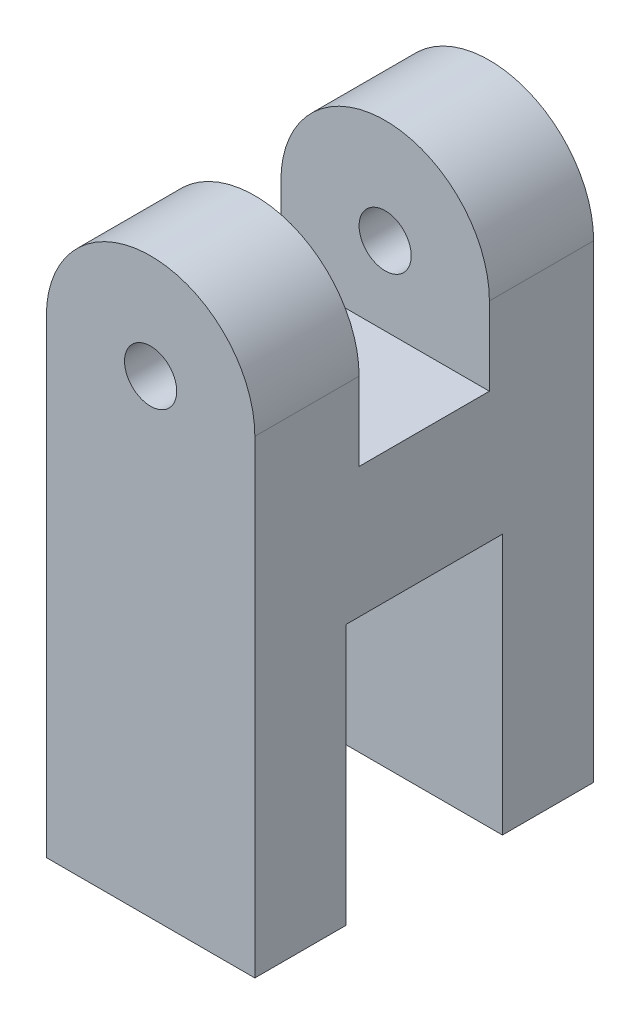
ISO-10303-21;
HEADER;
FILE_DESCRIPTION(('STEP AP214'),'2;1');
FILE_NAME('part.step','',(''),(''),'','','');
FILE_SCHEMA(('AUTOMOTIVE_DESIGN { 1 0 10303 214 1 1 1 1 }'));
ENDSEC;
DATA;
#1=APPLICATION_CONTEXT('core data for automotive mechanical design processes');
#2=APPLICATION_PROTOCOL_DEFINITION('international standard','automotive_design',2000,#1);
#3=PRODUCT_CONTEXT('',#1,'mechanical');
#4=PRODUCT('Part','Part','',(#3));
#5=PRODUCT_RELATED_PRODUCT_CATEGORY('part','',(#4));
#6=PRODUCT_DEFINITION_FORMATION('','',#4);
#7=PRODUCT_DEFINITION_CONTEXT('part definition',#1,'design');
#8=PRODUCT_DEFINITION('design','',#6,#7);
#9=PRODUCT_DEFINITION_SHAPE('','',#8);
#10=(LENGTH_UNIT() NAMED_UNIT(*) SI_UNIT(.MILLI.,.METRE.));
#11=(NAMED_UNIT(*) PLANE_ANGLE_UNIT() SI_UNIT($,.RADIAN.));
#12=(NAMED_UNIT(*) SI_UNIT($,.STERADIAN.) SOLID_ANGLE_UNIT());
#13=UNCERTAINTY_MEASURE_WITH_UNIT(LENGTH_MEASURE(1.E-05),#10,'distance_accuracy_value','');
#14=(GEOMETRIC_REPRESENTATION_CONTEXT(3) GLOBAL_UNCERTAINTY_ASSIGNED_CONTEXT((#13)) GLOBAL_UNIT_ASSIGNED_CONTEXT((#10,
#11,#12)) REPRESENTATION_CONTEXT('',''));
#15=CARTESIAN_POINT('',(0.,0.,0.));
#16=DIRECTION('',(0.,0.,1.));
#17=DIRECTION('',(1.,0.,0.));
#18=AXIS2_PLACEMENT_3D('',#15,#16,#17);
#19=CARTESIAN_POINT('',(-4.,12.,6.5));
#20=DIRECTION('',(0.,0.,-1.));
#21=DIRECTION('',(-1.,0.,0.));
#22=AXIS2_PLACEMENT_3D('',#19,#20,#21);
#23=PLANE('',#22);
#24=CARTESIAN_POINT('',(0.,8.,6.5));
#25=DIRECTION('',(0.,0.,-1.));
#26=DIRECTION('',(-1.,0.,0.));
#27=AXIS2_PLACEMENT_3D('',#24,#25,#26);
#28=CIRCLE('',#27,1.);
#29=CARTESIAN_POINT('',(-1.,8.,6.5));
#30=VERTEX_POINT('',#29);
#31=EDGE_CURVE('E192',#30,#30,#28,.T.);
#32=ORIENTED_EDGE('',*,*,#31,.T.);
#33=EDGE_LOOP('',(#32));
#34=FACE_BOUND('',#33,.T.);
#35=CARTESIAN_POINT('',(0.,8.,6.5));
#36=DIRECTION('',(0.,0.,1.));
#37=DIRECTION('',(1.,0.,0.));
#38=AXIS2_PLACEMENT_3D('',#35,#36,#37);
#39=CIRCLE('',#38,4.);
#40=CARTESIAN_POINT('',(-4.,8.,6.5));
#41=VERTEX_POINT('',#40);
#42=CARTESIAN_POINT('',(4.,8.,6.5));
#43=VERTEX_POINT('',#42);
#44=EDGE_CURVE('E182',#41,#43,#39,.F.);
#45=ORIENTED_EDGE('',*,*,#44,.F.);
#46=DIRECTION('',(0.,-1.,0.));
#47=VECTOR('',#46,1.);
#48=CARTESIAN_POINT('',(-4.,12.,6.5));
#49=LINE('',#48,#47);
#50=CARTESIAN_POINT('',(-4.,-10.,6.5));
#51=VERTEX_POINT('',#50);
#52=EDGE_CURVE('E133',#41,#51,#49,.T.);
#53=ORIENTED_EDGE('',*,*,#52,.T.);
#54=DIRECTION('',(1.,0.,0.));
#55=VECTOR('',#54,1.);
#56=CARTESIAN_POINT('',(4.,-10.,6.5));
#57=LINE('',#56,#55);
#58=CARTESIAN_POINT('',(4.,-10.,6.5));
#59=VERTEX_POINT('',#58);
#60=EDGE_CURVE('E140',#51,#59,#57,.T.);
#61=ORIENTED_EDGE('',*,*,#60,.T.);
#62=DIRECTION('',(0.,-1.,0.));
#63=VECTOR('',#62,1.);
#64=CARTESIAN_POINT('',(4.,12.,6.5));
#65=LINE('',#64,#63);
#66=EDGE_CURVE('E121',#43,#59,#65,.T.);
#67=ORIENTED_EDGE('',*,*,#66,.F.);
#68=EDGE_LOOP('',(#45,#53,#61,#67));
#69=FACE_BOUND('',#68,.T.);
#70=ADVANCED_FACE('F33',(#34,#69),#23,.F.);
#71=CARTESIAN_POINT('',(-4.,12.,-6.5));
#72=DIRECTION('',(0.,0.,1.));
#73=DIRECTION('',(1.,0.,0.));
#74=AXIS2_PLACEMENT_3D('',#71,#72,#73);
#75=PLANE('',#74);
#76=CARTESIAN_POINT('',(0.,8.,-6.5));
#77=DIRECTION('',(0.,0.,-1.));
#78=DIRECTION('',(-1.,0.,0.));
#79=AXIS2_PLACEMENT_3D('',#76,#77,#78);
#80=CIRCLE('',#79,1.);
#81=CARTESIAN_POINT('',(-1.,8.,-6.5));
#82=VERTEX_POINT('',#81);
#83=EDGE_CURVE('E191',#82,#82,#80,.T.);
#84=ORIENTED_EDGE('',*,*,#83,.F.);
#85=EDGE_LOOP('',(#84));
#86=FACE_BOUND('',#85,.T.);
#87=DIRECTION('',(0.,-1.,0.));
#88=VECTOR('',#87,1.);
#89=CARTESIAN_POINT('',(-4.,12.,-6.5));
#90=LINE('',#89,#88);
#91=CARTESIAN_POINT('',(-4.,8.,-6.5));
#92=VERTEX_POINT('',#91);
#93=CARTESIAN_POINT('',(-4.,-10.,-6.5));
#94=VERTEX_POINT('',#93);
#95=EDGE_CURVE('E222',#92,#94,#90,.T.);
#96=ORIENTED_EDGE('',*,*,#95,.F.);
#97=CARTESIAN_POINT('',(0.,8.,-6.5));
#98=DIRECTION('',(0.,0.,1.));
#99=DIRECTION('',(1.,0.,0.));
#100=AXIS2_PLACEMENT_3D('',#97,#98,#99);
#101=CIRCLE('',#100,4.);
#102=CARTESIAN_POINT('',(4.,8.,-6.5));
#103=VERTEX_POINT('',#102);
#104=EDGE_CURVE('E181',#92,#103,#101,.F.);
#105=ORIENTED_EDGE('',*,*,#104,.T.);
#106=DIRECTION('',(0.,-1.,0.));
#107=VECTOR('',#106,1.);
#108=CARTESIAN_POINT('',(4.,12.,-6.5));
#109=LINE('',#108,#107);
#110=CARTESIAN_POINT('',(4.,-10.,-6.5));
#111=VERTEX_POINT('',#110);
#112=EDGE_CURVE('E134',#103,#111,#109,.T.);
#113=ORIENTED_EDGE('',*,*,#112,.T.);
#114=DIRECTION('',(1.,0.,0.));
#115=VECTOR('',#114,1.);
#116=CARTESIAN_POINT('',(4.,-10.,-6.5));
#117=LINE('',#116,#115);
#118=EDGE_CURVE('E166',#94,#111,#117,.T.);
#119=ORIENTED_EDGE('',*,*,#118,.F.);
#120=EDGE_LOOP('',(#96,#105,#113,#119));
#121=FACE_BOUND('',#120,.T.);
#122=ADVANCED_FACE('F251',(#86,#121),#75,.F.);
#123=CARTESIAN_POINT('',(-6.5,5.,-2.5));
#124=DIRECTION('',(0.,0.,-1.));
#125=DIRECTION('',(-1.,0.,0.));
#126=AXIS2_PLACEMENT_3D('',#123,#124,#125);
#127=PLANE('',#126);
#128=CARTESIAN_POINT('',(0.,8.,-2.5));
#129=DIRECTION('',(0.,0.,-1.));
#130=DIRECTION('',(-1.,0.,0.));
#131=AXIS2_PLACEMENT_3D('',#128,#129,#130);
#132=CIRCLE('',#131,1.);
#133=CARTESIAN_POINT('',(-1.,8.,-2.5));
#134=VERTEX_POINT('',#133);
#135=EDGE_CURVE('E198',#134,#134,#132,.T.);
#136=ORIENTED_EDGE('',*,*,#135,.T.);
#137=EDGE_LOOP('',(#136));
#138=FACE_BOUND('',#137,.T.);
#139=CARTESIAN_POINT('',(0.,8.,-2.5));
#140=DIRECTION('',(0.,0.,-1.));
#141=DIRECTION('',(-1.,0.,0.));
#142=AXIS2_PLACEMENT_3D('',#139,#140,#141);
#143=CIRCLE('',#142,4.);
#144=CARTESIAN_POINT('',(-4.,8.,-2.5));
#145=VERTEX_POINT('',#144);
#146=CARTESIAN_POINT('',(4.,8.,-2.50000000000002));
#147=VERTEX_POINT('',#146);
#148=EDGE_CURVE('E188',#145,#147,#143,.T.);
#149=ORIENTED_EDGE('',*,*,#148,.F.);
#150=DIRECTION('',(0.,1.,0.));
#151=VECTOR('',#150,1.);
#152=CARTESIAN_POINT('',(-4.,12.,-2.5));
#153=LINE('',#152,#151);
#154=CARTESIAN_POINT('',(-4.,5.,-2.5));
#155=VERTEX_POINT('',#154);
#156=EDGE_CURVE('E213',#155,#145,#153,.T.);
#157=ORIENTED_EDGE('',*,*,#156,.F.);
#158=DIRECTION('',(-1.,0.,0.));
#159=VECTOR('',#158,1.);
#160=CARTESIAN_POINT('',(-6.5,5.,-2.5));
#161=LINE('',#160,#159);
#162=CARTESIAN_POINT('',(4.,5.,-2.5));
#163=VERTEX_POINT('',#162);
#164=EDGE_CURVE('E204',#163,#155,#161,.T.);
#165=ORIENTED_EDGE('',*,*,#164,.F.);
#166=DIRECTION('',(0.,-1.,0.));
#167=VECTOR('',#166,1.);
#168=CARTESIAN_POINT('',(4.,12.,-2.5));
#169=LINE('',#168,#167);
#170=EDGE_CURVE('E211',#147,#163,#169,.T.);
#171=ORIENTED_EDGE('',*,*,#170,.F.);
#172=EDGE_LOOP('',(#149,#157,#165,#171));
#173=FACE_BOUND('',#172,.T.);
#174=ADVANCED_FACE('F256',(#138,#173),#127,.F.);
#175=CARTESIAN_POINT('',(-6.5,5.,2.5));
#176=DIRECTION('',(0.,0.,1.));
#177=DIRECTION('',(1.,0.,0.));
#178=AXIS2_PLACEMENT_3D('',#175,#176,#177);
#179=PLANE('',#178);
#180=CARTESIAN_POINT('',(0.,8.,2.5));
#181=DIRECTION('',(0.,0.,1.));
#182=DIRECTION('',(1.,0.,0.));
#183=AXIS2_PLACEMENT_3D('',#180,#181,#182);
#184=CIRCLE('',#183,1.);
#185=CARTESIAN_POINT('',(-1.,8.,2.5));
#186=VERTEX_POINT('',#185);
#187=EDGE_CURVE('E195',#186,#186,#184,.T.);
#188=ORIENTED_EDGE('',*,*,#187,.T.);
#189=EDGE_LOOP('',(#188));
#190=FACE_BOUND('',#189,.T.);
#191=DIRECTION('',(0.,-1.,0.));
#192=VECTOR('',#191,1.);
#193=CARTESIAN_POINT('',(-4.,12.,2.5));
#194=LINE('',#193,#192);
#195=CARTESIAN_POINT('',(-4.,8.,2.5));
#196=VERTEX_POINT('',#195);
#197=CARTESIAN_POINT('',(-4.,5.,2.5));
#198=VERTEX_POINT('',#197);
#199=EDGE_CURVE('E209',#196,#198,#194,.T.);
#200=ORIENTED_EDGE('',*,*,#199,.F.);
#201=CARTESIAN_POINT('',(0.,8.,2.5));
#202=DIRECTION('',(0.,0.,1.));
#203=DIRECTION('',(1.,0.,0.));
#204=AXIS2_PLACEMENT_3D('',#201,#202,#203);
#205=CIRCLE('',#204,4.);
#206=CARTESIAN_POINT('',(4.,8.,2.5));
#207=VERTEX_POINT('',#206);
#208=EDGE_CURVE('E11',#207,#196,#205,.T.);
#209=ORIENTED_EDGE('',*,*,#208,.F.);
#210=DIRECTION('',(0.,1.,0.));
#211=VECTOR('',#210,1.);
#212=CARTESIAN_POINT('',(4.,12.,2.5));
#213=LINE('',#212,#211);
#214=CARTESIAN_POINT('',(4.,5.,2.5));
#215=VERTEX_POINT('',#214);
#216=EDGE_CURVE('E207',#215,#207,#213,.T.);
#217=ORIENTED_EDGE('',*,*,#216,.F.);
#218=DIRECTION('',(1.,0.,0.));
#219=VECTOR('',#218,1.);
#220=CARTESIAN_POINT('',(-6.5,5.,2.5));
#221=LINE('',#220,#219);
#222=EDGE_CURVE('E201',#198,#215,#221,.T.);
#223=ORIENTED_EDGE('',*,*,#222,.F.);
#224=EDGE_LOOP('',(#200,#209,#217,#223));
#225=FACE_BOUND('',#224,.T.);
#226=ADVANCED_FACE('F230',(#190,#225),#179,.F.);
#227=CARTESIAN_POINT('',(-4.,12.,6.5));
#228=DIRECTION('',(1.,0.,0.));
#229=DIRECTION('',(0.,0.,-1.));
#230=AXIS2_PLACEMENT_3D('',#227,#228,#229);
#231=PLANE('',#230);
#232=ORIENTED_EDGE('',*,*,#52,.F.);
#233=DIRECTION('',(0.,0.,1.));
#234=VECTOR('',#233,1.);
#235=CARTESIAN_POINT('',(-4.,8.,-30.7706097986845));
#236=LINE('',#235,#234);
#237=EDGE_CURVE('E177',#196,#41,#236,.T.);
#238=ORIENTED_EDGE('',*,*,#237,.F.);
#239=ORIENTED_EDGE('',*,*,#199,.T.);
#240=DIRECTION('',(0.,0.,-1.));
#241=VECTOR('',#240,1.);
#242=CARTESIAN_POINT('',(-4.,5.,6.5));
#243=LINE('',#242,#241);
#244=EDGE_CURVE('E216',#198,#155,#243,.T.);
#245=ORIENTED_EDGE('',*,*,#244,.T.);
#246=ORIENTED_EDGE('',*,*,#156,.T.);
#247=EDGE_CURVE('E178',#92,#145,#236,.T.);
#248=ORIENTED_EDGE('',*,*,#247,.F.);
#249=ORIENTED_EDGE('',*,*,#95,.T.);
#250=DIRECTION('',(0.,0.,-1.));
#251=VECTOR('',#250,1.);
#252=CARTESIAN_POINT('',(-4.,-10.,-6.5));
#253=LINE('',#252,#251);
#254=CARTESIAN_POINT('',(-4.,-10.,-3.));
#255=VERTEX_POINT('',#254);
#256=EDGE_CURVE('E163',#255,#94,#253,.T.);
#257=ORIENTED_EDGE('',*,*,#256,.F.);
#258=DIRECTION('',(0.,1.,0.));
#259=VECTOR('',#258,1.);
#260=CARTESIAN_POINT('',(-4.,-10.,-3.));
#261=LINE('',#260,#259);
#262=CARTESIAN_POINT('',(-4.,0.,-3.));
#263=VERTEX_POINT('',#262);
#264=EDGE_CURVE('E169',#255,#263,#261,.T.);
#265=ORIENTED_EDGE('',*,*,#264,.T.);
#266=DIRECTION('',(0.,0.,1.));
#267=VECTOR('',#266,1.);
#268=CARTESIAN_POINT('',(-4.,0.,6.5));
#269=LINE('',#268,#267);
#270=CARTESIAN_POINT('',(-4.,0.,3.));
#271=VERTEX_POINT('',#270);
#272=EDGE_CURVE('E219',#263,#271,#269,.T.);
#273=ORIENTED_EDGE('',*,*,#272,.T.);
#274=DIRECTION('',(0.,1.,0.));
#275=VECTOR('',#274,1.);
#276=CARTESIAN_POINT('',(-4.,-10.,3.));
#277=LINE('',#276,#275);
#278=CARTESIAN_POINT('',(-4.,-10.,3.));
#279=VERTEX_POINT('',#278);
#280=EDGE_CURVE('E154',#279,#271,#277,.T.);
#281=ORIENTED_EDGE('',*,*,#280,.F.);
#282=DIRECTION('',(0.,0.,1.));
#283=VECTOR('',#282,1.);
#284=CARTESIAN_POINT('',(-4.,-10.,6.5));
#285=LINE('',#284,#283);
#286=EDGE_CURVE('E146',#279,#51,#285,.T.);
#287=ORIENTED_EDGE('',*,*,#286,.T.);
#288=EDGE_LOOP('',(#232,#238,#239,#245,#246,#248,#249,#257,#265,#273,#281,#287));
#289=FACE_BOUND('',#288,.T.);
#290=ADVANCED_FACE('F35',(#289),#231,.F.);
#291=CARTESIAN_POINT('',(4.,12.,6.5));
#292=DIRECTION('',(-1.,0.,0.));
#293=DIRECTION('',(0.,0.,1.));
#294=AXIS2_PLACEMENT_3D('',#291,#292,#293);
#295=PLANE('',#294);
#296=ORIENTED_EDGE('',*,*,#112,.F.);
#297=DIRECTION('',(0.,0.,1.));
#298=VECTOR('',#297,1.);
#299=CARTESIAN_POINT('',(4.,8.,-35.7706097986845));
#300=LINE('',#299,#298);
#301=EDGE_CURVE('E185',#103,#147,#300,.T.);
#302=ORIENTED_EDGE('',*,*,#301,.T.);
#303=ORIENTED_EDGE('',*,*,#170,.T.);
#304=DIRECTION('',(0.,0.,1.));
#305=VECTOR('',#304,1.);
#306=CARTESIAN_POINT('',(4.,5.,6.5));
#307=LINE('',#306,#305);
#308=EDGE_CURVE('E41',#163,#215,#307,.T.);
#309=ORIENTED_EDGE('',*,*,#308,.T.);
#310=ORIENTED_EDGE('',*,*,#216,.T.);
#311=EDGE_CURVE('E129',#207,#43,#300,.T.);
#312=ORIENTED_EDGE('',*,*,#311,.T.);
#313=ORIENTED_EDGE('',*,*,#66,.T.);
#314=DIRECTION('',(0.,0.,-1.));
#315=VECTOR('',#314,1.);
#316=CARTESIAN_POINT('',(4.,-10.,6.5));
#317=LINE('',#316,#315);
#318=CARTESIAN_POINT('',(4.,-10.,3.));
#319=VERTEX_POINT('',#318);
#320=EDGE_CURVE('E125',#59,#319,#317,.T.);
#321=ORIENTED_EDGE('',*,*,#320,.T.);
#322=DIRECTION('',(0.,1.,0.));
#323=VECTOR('',#322,1.);
#324=CARTESIAN_POINT('',(4.,-10.,3.));
#325=LINE('',#324,#323);
#326=CARTESIAN_POINT('',(4.,0.,3.));
#327=VERTEX_POINT('',#326);
#328=EDGE_CURVE('E151',#319,#327,#325,.T.);
#329=ORIENTED_EDGE('',*,*,#328,.T.);
#330=DIRECTION('',(0.,0.,-1.));
#331=VECTOR('',#330,1.);
#332=CARTESIAN_POINT('',(4.,0.,6.5));
#333=LINE('',#332,#331);
#334=CARTESIAN_POINT('',(4.,0.,-3.));
#335=VERTEX_POINT('',#334);
#336=EDGE_CURVE('E55',#327,#335,#333,.T.);
#337=ORIENTED_EDGE('',*,*,#336,.T.);
#338=DIRECTION('',(0.,1.,0.));
#339=VECTOR('',#338,1.);
#340=CARTESIAN_POINT('',(4.,-10.,-3.));
#341=LINE('',#340,#339);
#342=CARTESIAN_POINT('',(4.,-10.,-3.));
#343=VERTEX_POINT('',#342);
#344=EDGE_CURVE('E174',#343,#335,#341,.T.);
#345=ORIENTED_EDGE('',*,*,#344,.F.);
#346=DIRECTION('',(0.,0.,1.));
#347=VECTOR('',#346,1.);
#348=CARTESIAN_POINT('',(4.,-10.,-6.5));
#349=LINE('',#348,#347);
#350=EDGE_CURVE('E158',#111,#343,#349,.T.);
#351=ORIENTED_EDGE('',*,*,#350,.F.);
#352=EDGE_LOOP('',(#296,#302,#303,#309,#310,#312,#313,#321,#329,#337,#345,#351));
#353=FACE_BOUND('',#352,.T.);
#354=ADVANCED_FACE('F124',(#353),#295,.F.);
#355=CARTESIAN_POINT('',(0.,0.,0.));
#356=DIRECTION('',(0.,-1.,0.));
#357=DIRECTION('',(0.,0.,-1.));
#358=AXIS2_PLACEMENT_3D('',#355,#356,#357);
#359=PLANE('',#358);
#360=DIRECTION('',(-1.,0.,0.));
#361=VECTOR('',#360,1.);
#362=CARTESIAN_POINT('',(4.,0.,3.));
#363=LINE('',#362,#361);
#364=EDGE_CURVE('E48',#327,#271,#363,.T.);
#365=ORIENTED_EDGE('',*,*,#364,.T.);
#366=ORIENTED_EDGE('',*,*,#272,.F.);
#367=DIRECTION('',(-1.,0.,0.));
#368=VECTOR('',#367,1.);
#369=CARTESIAN_POINT('',(4.,0.,-3.));
#370=LINE('',#369,#368);
#371=EDGE_CURVE('E157',#335,#263,#370,.T.);
#372=ORIENTED_EDGE('',*,*,#371,.F.);
#373=ORIENTED_EDGE('',*,*,#336,.F.);
#374=EDGE_LOOP('',(#365,#366,#372,#373));
#375=FACE_BOUND('',#374,.T.);
#376=ADVANCED_FACE('F245',(#375),#359,.T.);
#377=CARTESIAN_POINT('',(0.,5.,0.));
#378=DIRECTION('',(0.,-1.,0.));
#379=DIRECTION('',(0.,0.,-1.));
#380=AXIS2_PLACEMENT_3D('',#377,#378,#379);
#381=PLANE('',#380);
#382=ORIENTED_EDGE('',*,*,#222,.T.);
#383=ORIENTED_EDGE('',*,*,#308,.F.);
#384=ORIENTED_EDGE('',*,*,#164,.T.);
#385=ORIENTED_EDGE('',*,*,#244,.F.);
#386=EDGE_LOOP('',(#382,#383,#384,#385));
#387=FACE_BOUND('',#386,.T.);
#388=ADVANCED_FACE('F236',(#387),#381,.F.);
#389=CARTESIAN_POINT('',(0.,8.,6.5));
#390=DIRECTION('',(0.,0.,-1.));
#391=DIRECTION('',(-1.,0.,0.));
#392=AXIS2_PLACEMENT_3D('',#389,#390,#391);
#393=CYLINDRICAL_SURFACE('',#392,1.);
#394=CARTESIAN_POINT('',(-1.,8.,6.5));
#395=CARTESIAN_POINT('',(-1.,8.,6.45833333333333));
#396=CARTESIAN_POINT('',(-1.,8.,6.41666666666667));
#397=CARTESIAN_POINT('',(-1.,8.,6.33333333333333));
#398=CARTESIAN_POINT('',(-1.,8.,6.29166666666667));
#399=CARTESIAN_POINT('',(-1.,8.,6.20833333333333));
#400=CARTESIAN_POINT('',(-1.,8.,6.16666666666667));
#401=CARTESIAN_POINT('',(-1.,8.,6.08333333333333));
#402=CARTESIAN_POINT('',(-1.,8.,6.04166666666667));
#403=CARTESIAN_POINT('',(-1.,8.,5.95833333333333));
#404=CARTESIAN_POINT('',(-1.,8.,5.91666666666667));
#405=CARTESIAN_POINT('',(-1.,8.,5.83333333333333));
#406=CARTESIAN_POINT('',(-1.,8.,5.79166666666667));
#407=CARTESIAN_POINT('',(-1.,8.,5.70833333333333));
#408=CARTESIAN_POINT('',(-1.,8.,5.66666666666667));
#409=CARTESIAN_POINT('',(-1.,8.,5.58333333333333));
#410=CARTESIAN_POINT('',(-1.,8.,5.54166666666667));
#411=CARTESIAN_POINT('',(-1.,8.,5.45833333333333));
#412=CARTESIAN_POINT('',(-1.,8.,5.41666666666667));
#413=CARTESIAN_POINT('',(-1.,8.,5.33333333333333));
#414=CARTESIAN_POINT('',(-1.,8.,5.29166666666667));
#415=CARTESIAN_POINT('',(-1.,8.,5.20833333333333));
#416=CARTESIAN_POINT('',(-1.,8.,5.16666666666667));
#417=CARTESIAN_POINT('',(-1.,8.,5.08333333333333));
#418=CARTESIAN_POINT('',(-1.,8.,5.04166666666667));
#419=CARTESIAN_POINT('',(-1.,8.,4.95833333333333));
#420=CARTESIAN_POINT('',(-1.,8.,4.91666666666667));
#421=CARTESIAN_POINT('',(-1.,8.,4.83333333333333));
#422=CARTESIAN_POINT('',(-1.,8.,4.79166666666667));
#423=CARTESIAN_POINT('',(-1.,8.,4.70833333333333));
#424=CARTESIAN_POINT('',(-1.,8.,4.66666666666667));
#425=CARTESIAN_POINT('',(-1.,8.,4.58333333333333));
#426=CARTESIAN_POINT('',(-1.,8.,4.54166666666667));
#427=CARTESIAN_POINT('',(-1.,8.,4.45833333333333));
#428=CARTESIAN_POINT('',(-1.,8.,4.41666666666667));
#429=CARTESIAN_POINT('',(-1.,8.,4.33333333333333));
#430=CARTESIAN_POINT('',(-1.,8.,4.29166666666667));
#431=CARTESIAN_POINT('',(-1.,8.,4.20833333333333));
#432=CARTESIAN_POINT('',(-1.,8.,4.16666666666667));
#433=CARTESIAN_POINT('',(-1.,8.,4.08333333333333));
#434=CARTESIAN_POINT('',(-1.,8.,4.04166666666667));
#435=CARTESIAN_POINT('',(-1.,8.,3.95833333333333));
#436=CARTESIAN_POINT('',(-1.,8.,3.91666666666667));
#437=CARTESIAN_POINT('',(-1.,8.,3.83333333333333));
#438=CARTESIAN_POINT('',(-1.,8.,3.79166666666667));
#439=CARTESIAN_POINT('',(-1.,8.,3.70833333333333));
#440=CARTESIAN_POINT('',(-1.,8.,3.66666666666667));
#441=CARTESIAN_POINT('',(-1.,8.,3.58333333333333));
#442=CARTESIAN_POINT('',(-1.,8.,3.54166666666667));
#443=CARTESIAN_POINT('',(-1.,8.,3.45833333333333));
#444=CARTESIAN_POINT('',(-1.,8.,3.41666666666667));
#445=CARTESIAN_POINT('',(-1.,8.,3.33333333333333));
#446=CARTESIAN_POINT('',(-1.,8.,3.29166666666667));
#447=CARTESIAN_POINT('',(-1.,8.,3.20833333333333));
#448=CARTESIAN_POINT('',(-1.,8.,3.16666666666667));
#449=CARTESIAN_POINT('',(-1.,8.,3.08333333333333));
#450=CARTESIAN_POINT('',(-1.,8.,3.04166666666667));
#451=CARTESIAN_POINT('',(-1.,8.,2.95833333333333));
#452=CARTESIAN_POINT('',(-1.,8.,2.91666666666667));
#453=CARTESIAN_POINT('',(-1.,8.,2.83333333333333));
#454=CARTESIAN_POINT('',(-1.,8.,2.79166666666667));
#455=CARTESIAN_POINT('',(-1.,8.,2.70833333333333));
#456=CARTESIAN_POINT('',(-1.,8.,2.66666666666667));
#457=CARTESIAN_POINT('',(-1.,8.,2.58333333333333));
#458=CARTESIAN_POINT('',(-1.,8.,2.54166666666667));
#459=CARTESIAN_POINT('',(-1.,8.,2.5));
#460=B_SPLINE_CURVE_WITH_KNOTS('',3,(#394,#395,#396,#397,#398,#399,#400,#401,#402,#403,#404,
#405,#406,#407,#408,#409,#410,#411,#412,#413,#414,#415,#416,#417,#418,#419,#420,#421,#422,#423,
#424,#425,#426,#427,#428,#429,#430,#431,#432,#433,#434,#435,#436,#437,#438,#439,#440,#441,#442,
#443,#444,#445,#446,#447,#448,#449,#450,#451,#452,#453,#454,#455,#456,#457,#458,#459),
.UNSPECIFIED.,.F.,.F.,(4,2,2,2,2,2,2,2,2,2,2,2,2,2,2,2,2,2,2,2,2,2,2,2,2,2,2,2,2,2,2,2,4),(0.,
0.125,0.25,0.375,0.5,0.625000000000001,0.75,0.875,1.,1.125,1.25,1.375,1.5,1.625,1.75,1.875,2.,
2.125,2.25,2.375,2.5,2.625,2.75,2.875,3.,3.125,3.25,3.375,3.5,3.625,3.75,3.875,4.),.UNSPECIFIED.);
#461=EDGE_CURVE('BSEAM233',#30,#186,#460,.T.);
#462=ORIENTED_EDGE('',*,*,#31,.F.);
#463=ORIENTED_EDGE('',*,*,#187,.F.);
#464=ORIENTED_EDGE('',*,*,#461,.T.);
#465=ORIENTED_EDGE('',*,*,#461,.F.);
#466=EDGE_LOOP('',(#462,#464,#463,#465));
#467=FACE_BOUND('',#466,.T.);
#468=ADVANCED_FACE('F233',(#467),#393,.F.);
#469=CARTESIAN_POINT('',(-1.,8.,-6.5));
#470=CARTESIAN_POINT('',(-1.,8.,-6.45833333333333));
#471=CARTESIAN_POINT('',(-1.,8.,-6.41666666666667));
#472=CARTESIAN_POINT('',(-1.,8.,-6.33333333333333));
#473=CARTESIAN_POINT('',(-1.,8.,-6.29166666666667));
#474=CARTESIAN_POINT('',(-1.,8.,-6.20833333333333));
#475=CARTESIAN_POINT('',(-1.,8.,-6.16666666666667));
#476=CARTESIAN_POINT('',(-1.,8.,-6.08333333333333));
#477=CARTESIAN_POINT('',(-1.,8.,-6.04166666666667));
#478=CARTESIAN_POINT('',(-1.,8.,-5.95833333333333));
#479=CARTESIAN_POINT('',(-1.,8.,-5.91666666666667));
#480=CARTESIAN_POINT('',(-1.,8.,-5.83333333333333));
#481=CARTESIAN_POINT('',(-1.,8.,-5.79166666666667));
#482=CARTESIAN_POINT('',(-1.,8.,-5.70833333333333));
#483=CARTESIAN_POINT('',(-1.,8.,-5.66666666666667));
#484=CARTESIAN_POINT('',(-1.,8.,-5.58333333333333));
#485=CARTESIAN_POINT('',(-1.,8.,-5.54166666666667));
#486=CARTESIAN_POINT('',(-1.,8.,-5.45833333333333));
#487=CARTESIAN_POINT('',(-1.,8.,-5.41666666666667));
#488=CARTESIAN_POINT('',(-1.,8.,-5.33333333333333));
#489=CARTESIAN_POINT('',(-1.,8.,-5.29166666666667));
#490=CARTESIAN_POINT('',(-1.,8.,-5.20833333333333));
#491=CARTESIAN_POINT('',(-1.,8.,-5.16666666666667));
#492=CARTESIAN_POINT('',(-1.,8.,-5.08333333333333));
#493=CARTESIAN_POINT('',(-1.,8.,-5.04166666666667));
#494=CARTESIAN_POINT('',(-1.,8.,-4.95833333333333));
#495=CARTESIAN_POINT('',(-1.,8.,-4.91666666666667));
#496=CARTESIAN_POINT('',(-1.,8.,-4.83333333333333));
#497=CARTESIAN_POINT('',(-1.,8.,-4.79166666666667));
#498=CARTESIAN_POINT('',(-1.,8.,-4.70833333333333));
#499=CARTESIAN_POINT('',(-1.,8.,-4.66666666666667));
#500=CARTESIAN_POINT('',(-1.,8.,-4.58333333333333));
#501=CARTESIAN_POINT('',(-1.,8.,-4.54166666666667));
#502=CARTESIAN_POINT('',(-1.,8.,-4.45833333333333));
#503=CARTESIAN_POINT('',(-1.,8.,-4.41666666666667));
#504=CARTESIAN_POINT('',(-1.,8.,-4.33333333333333));
#505=CARTESIAN_POINT('',(-1.,8.,-4.29166666666667));
#506=CARTESIAN_POINT('',(-1.,8.,-4.20833333333333));
#507=CARTESIAN_POINT('',(-1.,8.,-4.16666666666667));
#508=CARTESIAN_POINT('',(-1.,8.,-4.08333333333333));
#509=CARTESIAN_POINT('',(-1.,8.,-4.04166666666667));
#510=CARTESIAN_POINT('',(-1.,8.,-3.95833333333333));
#511=CARTESIAN_POINT('',(-1.,8.,-3.91666666666667));
#512=CARTESIAN_POINT('',(-1.,8.,-3.83333333333333));
#513=CARTESIAN_POINT('',(-1.,8.,-3.79166666666667));
#514=CARTESIAN_POINT('',(-1.,8.,-3.70833333333333));
#515=CARTESIAN_POINT('',(-1.,8.,-3.66666666666667));
#516=CARTESIAN_POINT('',(-1.,8.,-3.58333333333333));
#517=CARTESIAN_POINT('',(-1.,8.,-3.54166666666667));
#518=CARTESIAN_POINT('',(-1.,8.,-3.45833333333333));
#519=CARTESIAN_POINT('',(-1.,8.,-3.41666666666667));
#520=CARTESIAN_POINT('',(-1.,8.,-3.33333333333333));
#521=CARTESIAN_POINT('',(-1.,8.,-3.29166666666667));
#522=CARTESIAN_POINT('',(-1.,8.,-3.20833333333333));
#523=CARTESIAN_POINT('',(-1.,8.,-3.16666666666667));
#524=CARTESIAN_POINT('',(-1.,8.,-3.08333333333333));
#525=CARTESIAN_POINT('',(-1.,8.,-3.04166666666667));
#526=CARTESIAN_POINT('',(-1.,8.,-2.95833333333333));
#527=CARTESIAN_POINT('',(-1.,8.,-2.91666666666667));
#528=CARTESIAN_POINT('',(-1.,8.,-2.83333333333333));
#529=CARTESIAN_POINT('',(-1.,8.,-2.79166666666667));
#530=CARTESIAN_POINT('',(-1.,8.,-2.70833333333333));
#531=CARTESIAN_POINT('',(-1.,8.,-2.66666666666667));
#532=CARTESIAN_POINT('',(-1.,8.,-2.58333333333333));
#533=CARTESIAN_POINT('',(-1.,8.,-2.54166666666667));
#534=CARTESIAN_POINT('',(-1.,8.,-2.5));
#535=B_SPLINE_CURVE_WITH_KNOTS('',3,(#469,#470,#471,#472,#473,#474,#475,#476,#477,#478,#479,
#480,#481,#482,#483,#484,#485,#486,#487,#488,#489,#490,#491,#492,#493,#494,#495,#496,#497,#498,
#499,#500,#501,#502,#503,#504,#505,#506,#507,#508,#509,#510,#511,#512,#513,#514,#515,#516,#517,
#518,#519,#520,#521,#522,#523,#524,#525,#526,#527,#528,#529,#530,#531,#532,#533,#534),
.UNSPECIFIED.,.F.,.F.,(4,2,2,2,2,2,2,2,2,2,2,2,2,2,2,2,2,2,2,2,2,2,2,2,2,2,2,2,2,2,2,2,4),(0.,
0.125,0.25,0.375,0.5,0.625000000000001,0.750000000000001,0.875000000000001,1.,1.125,1.25,1.375,
1.5,1.625,1.75,1.875,2.,2.125,2.25,2.375,2.5,2.625,2.75,2.875,3.,3.125,3.25,3.375,3.5,3.625,
3.75,3.875,4.),.UNSPECIFIED.);
#536=EDGE_CURVE('BSEAM235',#82,#134,#535,.T.);
#537=ORIENTED_EDGE('',*,*,#83,.T.);
#538=ORIENTED_EDGE('',*,*,#135,.F.);
#539=ORIENTED_EDGE('',*,*,#536,.T.);
#540=ORIENTED_EDGE('',*,*,#536,.F.);
#541=EDGE_LOOP('',(#537,#539,#538,#540));
#542=FACE_BOUND('',#541,.T.);
#543=ADVANCED_FACE('F235',(#542),#393,.F.);
#544=CARTESIAN_POINT('',(0.,8.,-35.7706097986845));
#545=DIRECTION('',(0.,0.,1.));
#546=DIRECTION('',(1.,0.,0.));
#547=AXIS2_PLACEMENT_3D('',#544,#545,#546);
#548=CYLINDRICAL_SURFACE('',#547,4.);
#549=ORIENTED_EDGE('',*,*,#311,.F.);
#550=ORIENTED_EDGE('',*,*,#208,.T.);
#551=ORIENTED_EDGE('',*,*,#237,.T.);
#552=ORIENTED_EDGE('',*,*,#44,.T.);
#553=EDGE_LOOP('',(#549,#550,#551,#552));
#554=FACE_BOUND('',#553,.T.);
#555=ADVANCED_FACE('F243',(#554),#548,.T.);
#556=ORIENTED_EDGE('',*,*,#104,.F.);
#557=ORIENTED_EDGE('',*,*,#247,.T.);
#558=ORIENTED_EDGE('',*,*,#148,.T.);
#559=ORIENTED_EDGE('',*,*,#301,.F.);
#560=EDGE_LOOP('',(#556,#557,#558,#559));
#561=FACE_BOUND('',#560,.T.);
#562=ADVANCED_FACE('F276',(#561),#548,.T.);
#563=CARTESIAN_POINT('',(4.,-10.,-3.));
#564=DIRECTION('',(0.,0.,-1.));
#565=DIRECTION('',(-1.,0.,0.));
#566=AXIS2_PLACEMENT_3D('',#563,#564,#565);
#567=PLANE('',#566);
#568=ORIENTED_EDGE('',*,*,#371,.T.);
#569=ORIENTED_EDGE('',*,*,#264,.F.);
#570=DIRECTION('',(-1.,0.,0.));
#571=VECTOR('',#570,1.);
#572=CARTESIAN_POINT('',(4.,-10.,-3.));
#573=LINE('',#572,#571);
#574=EDGE_CURVE('E161',#343,#255,#573,.T.);
#575=ORIENTED_EDGE('',*,*,#574,.F.);
#576=ORIENTED_EDGE('',*,*,#344,.T.);
#577=EDGE_LOOP('',(#568,#569,#575,#576));
#578=FACE_BOUND('',#577,.T.);
#579=ADVANCED_FACE('F296',(#578),#567,.F.);
#580=CARTESIAN_POINT('',(0.,-10.,0.));
#581=DIRECTION('',(0.,-1.,0.));
#582=DIRECTION('',(0.,0.,-1.));
#583=AXIS2_PLACEMENT_3D('',#580,#581,#582);
#584=PLANE('',#583);
#585=ORIENTED_EDGE('',*,*,#350,.T.);
#586=ORIENTED_EDGE('',*,*,#574,.T.);
#587=ORIENTED_EDGE('',*,*,#256,.T.);
#588=ORIENTED_EDGE('',*,*,#118,.T.);
#589=EDGE_LOOP('',(#585,#586,#587,#588));
#590=FACE_BOUND('',#589,.T.);
#591=ADVANCED_FACE('F289',(#590),#584,.T.);
#592=CARTESIAN_POINT('',(4.,-10.,3.));
#593=DIRECTION('',(0.,0.,-1.));
#594=DIRECTION('',(-1.,0.,0.));
#595=AXIS2_PLACEMENT_3D('',#592,#593,#594);
#596=PLANE('',#595);
#597=ORIENTED_EDGE('',*,*,#364,.F.);
#598=ORIENTED_EDGE('',*,*,#328,.F.);
#599=DIRECTION('',(-1.,0.,0.));
#600=VECTOR('',#599,1.);
#601=CARTESIAN_POINT('',(4.,-10.,3.));
#602=LINE('',#601,#600);
#603=EDGE_CURVE('E143',#319,#279,#602,.T.);
#604=ORIENTED_EDGE('',*,*,#603,.T.);
#605=ORIENTED_EDGE('',*,*,#280,.T.);
#606=EDGE_LOOP('',(#597,#598,#604,#605));
#607=FACE_BOUND('',#606,.T.);
#608=ADVANCED_FACE('F287',(#607),#596,.T.);
#609=CARTESIAN_POINT('',(0.,-10.,0.));
#610=DIRECTION('',(0.,-1.,0.));
#611=DIRECTION('',(0.,0.,1.));
#612=AXIS2_PLACEMENT_3D('',#609,#610,#611);
#613=PLANE('',#612);
#614=ORIENTED_EDGE('',*,*,#320,.F.);
#615=ORIENTED_EDGE('',*,*,#60,.F.);
#616=ORIENTED_EDGE('',*,*,#286,.F.);
#617=ORIENTED_EDGE('',*,*,#603,.F.);
#618=EDGE_LOOP('',(#614,#615,#616,#617));
#619=FACE_BOUND('',#618,.T.);
#620=ADVANCED_FACE('F138',(#619),#613,.T.);
#621=CLOSED_SHELL('',(#70,#122,#174,#226,#290,#354,#376,#388,#468,#543,#555,#562,#579,#591,#608,#620));
#622=MANIFOLD_SOLID_BREP('B2',#621);
#623=ADVANCED_BREP_SHAPE_REPRESENTATION('',(#18,#622),#14);
#624=SHAPE_DEFINITION_REPRESENTATION(#9,#623);
ENDSEC;
END-ISO-10303-21;
